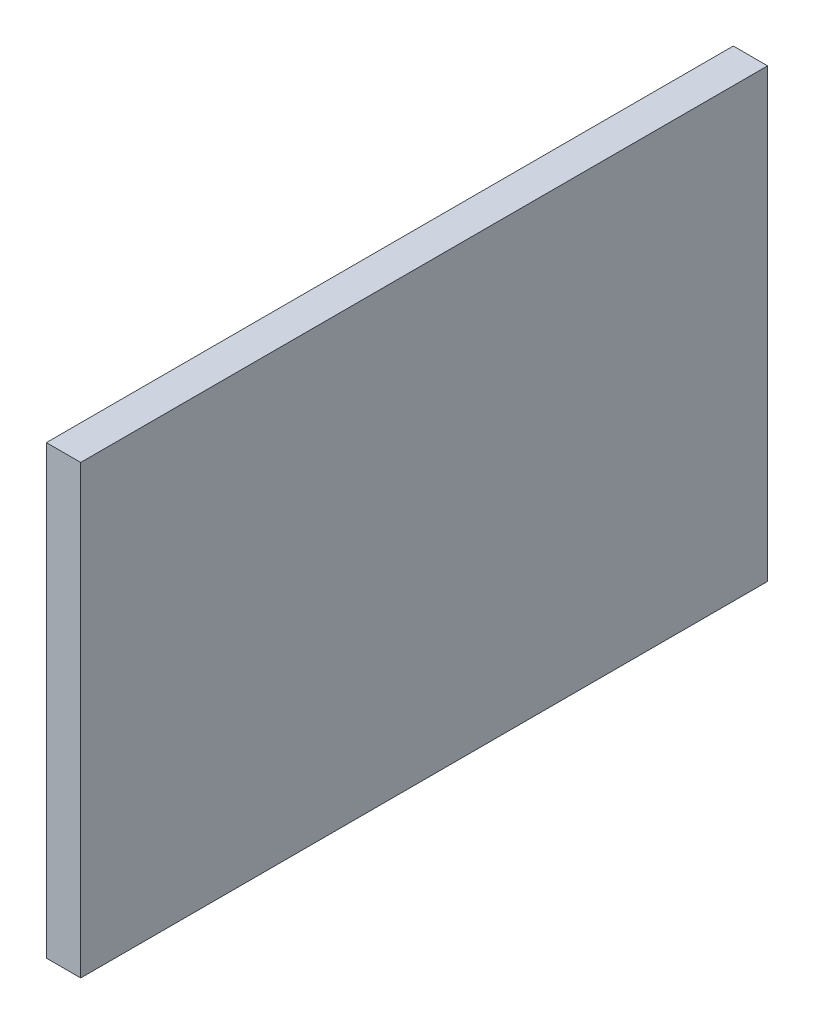
ISO-10303-21;
HEADER;
FILE_DESCRIPTION(('STEP AP214'),'2;1');
FILE_NAME('part.step','',(''),(''),'','','');
FILE_SCHEMA(('AUTOMOTIVE_DESIGN { 1 0 10303 214 1 1 1 1 }'));
ENDSEC;
DATA;
#1=APPLICATION_CONTEXT('core data for automotive mechanical design processes');
#2=APPLICATION_PROTOCOL_DEFINITION('international standard','automotive_design',2000,#1);
#3=PRODUCT_CONTEXT('',#1,'mechanical');
#4=PRODUCT('Part','Part','',(#3));
#5=PRODUCT_RELATED_PRODUCT_CATEGORY('part','',(#4));
#6=PRODUCT_DEFINITION_FORMATION('','',#4);
#7=PRODUCT_DEFINITION_CONTEXT('part definition',#1,'design');
#8=PRODUCT_DEFINITION('design','',#6,#7);
#9=PRODUCT_DEFINITION_SHAPE('','',#8);
#10=(LENGTH_UNIT() NAMED_UNIT(*) SI_UNIT(.MILLI.,.METRE.));
#11=(NAMED_UNIT(*) PLANE_ANGLE_UNIT() SI_UNIT($,.RADIAN.));
#12=(NAMED_UNIT(*) SI_UNIT($,.STERADIAN.) SOLID_ANGLE_UNIT());
#13=UNCERTAINTY_MEASURE_WITH_UNIT(LENGTH_MEASURE(1.E-05),#10,'distance_accuracy_value','');
#14=(GEOMETRIC_REPRESENTATION_CONTEXT(3) GLOBAL_UNCERTAINTY_ASSIGNED_CONTEXT((#13)) GLOBAL_UNIT_ASSIGNED_CONTEXT((#10,
#11,#12)) REPRESENTATION_CONTEXT('',''));
#15=CARTESIAN_POINT('',(0.,0.,0.));
#16=DIRECTION('',(0.,0.,1.));
#17=DIRECTION('',(1.,0.,0.));
#18=AXIS2_PLACEMENT_3D('',#15,#16,#17);
#19=CARTESIAN_POINT('',(25.4,26.8007352941176,466.818382352941));
#20=DIRECTION('',(0.,0.,-1.));
#21=DIRECTION('',(0.,1.,0.));
#22=AXIS2_PLACEMENT_3D('',#19,#20,#21);
#23=PLANE('',#22);
#24=DIRECTION('',(0.,-1.,0.));
#25=VECTOR('',#24,1.);
#26=CARTESIAN_POINT('',(0.,26.8007352941176,466.818382352941));
#27=LINE('',#26,#25);
#28=CARTESIAN_POINT('',(0.,26.8007352941176,466.818382352941));
#29=VERTEX_POINT('',#28);
#30=CARTESIAN_POINT('',(0.,-303.399264705882,466.818382352941));
#31=VERTEX_POINT('',#30);
#32=EDGE_CURVE('E97',#29,#31,#27,.T.);
#33=ORIENTED_EDGE('',*,*,#32,.T.);
#34=DIRECTION('',(-1.,0.,0.));
#35=VECTOR('',#34,1.);
#36=CARTESIAN_POINT('',(25.4,-303.399264705882,466.818382352941));
#37=LINE('',#36,#35);
#38=CARTESIAN_POINT('',(25.4,-303.399264705882,466.818382352941));
#39=VERTEX_POINT('',#38);
#40=EDGE_CURVE('E11',#39,#31,#37,.T.);
#41=ORIENTED_EDGE('',*,*,#40,.F.);
#42=DIRECTION('',(0.,-1.,0.));
#43=VECTOR('',#42,1.);
#44=CARTESIAN_POINT('',(25.4,26.8007352941176,466.818382352941));
#45=LINE('',#44,#43);
#46=CARTESIAN_POINT('',(25.4,26.8007352941176,466.818382352941));
#47=VERTEX_POINT('',#46);
#48=EDGE_CURVE('E85',#47,#39,#45,.T.);
#49=ORIENTED_EDGE('',*,*,#48,.F.);
#50=DIRECTION('',(-1.,0.,0.));
#51=VECTOR('',#50,1.);
#52=CARTESIAN_POINT('',(25.4,26.8007352941176,466.818382352941));
#53=LINE('',#52,#51);
#54=EDGE_CURVE('E93',#47,#29,#53,.T.);
#55=ORIENTED_EDGE('',*,*,#54,.T.);
#56=EDGE_LOOP('',(#33,#41,#49,#55));
#57=FACE_BOUND('',#56,.T.);
#58=ADVANCED_FACE('F34',(#57),#23,.F.);
#59=CARTESIAN_POINT('',(25.4,-303.399264705882,466.818382352941));
#60=DIRECTION('',(0.,1.,0.));
#61=DIRECTION('',(0.,0.,1.));
#62=AXIS2_PLACEMENT_3D('',#59,#60,#61);
#63=PLANE('',#62);
#64=DIRECTION('',(0.,0.,-1.));
#65=VECTOR('',#64,1.);
#66=CARTESIAN_POINT('',(0.,-303.399264705882,466.818382352941));
#67=LINE('',#66,#65);
#68=CARTESIAN_POINT('',(0.,-303.399264705882,-41.1816176470589));
#69=VERTEX_POINT('',#68);
#70=EDGE_CURVE('E89',#31,#69,#67,.T.);
#71=ORIENTED_EDGE('',*,*,#70,.T.);
#72=DIRECTION('',(-1.,0.,0.));
#73=VECTOR('',#72,1.);
#74=CARTESIAN_POINT('',(25.4,-303.399264705882,-41.1816176470589));
#75=LINE('',#74,#73);
#76=CARTESIAN_POINT('',(25.4,-303.399264705882,-41.1816176470589));
#77=VERTEX_POINT('',#76);
#78=EDGE_CURVE('E42',#77,#69,#75,.T.);
#79=ORIENTED_EDGE('',*,*,#78,.F.);
#80=DIRECTION('',(0.,0.,-1.));
#81=VECTOR('',#80,1.);
#82=CARTESIAN_POINT('',(25.4,-303.399264705882,466.818382352941));
#83=LINE('',#82,#81);
#84=EDGE_CURVE('E80',#39,#77,#83,.T.);
#85=ORIENTED_EDGE('',*,*,#84,.F.);
#86=ORIENTED_EDGE('',*,*,#40,.T.);
#87=EDGE_LOOP('',(#71,#79,#85,#86));
#88=FACE_BOUND('',#87,.T.);
#89=ADVANCED_FACE('F88',(#88),#63,.F.);
#90=CARTESIAN_POINT('',(25.4,26.8007352941176,-41.1816176470588));
#91=DIRECTION('',(0.,0.,1.));
#92=DIRECTION('',(0.,-1.,0.));
#93=AXIS2_PLACEMENT_3D('',#90,#91,#92);
#94=PLANE('',#93);
#95=DIRECTION('',(0.,1.,0.));
#96=VECTOR('',#95,1.);
#97=CARTESIAN_POINT('',(0.,26.8007352941176,-41.1816176470588));
#98=LINE('',#97,#96);
#99=CARTESIAN_POINT('',(0.,26.8007352941176,-41.1816176470588));
#100=VERTEX_POINT('',#99);
#101=EDGE_CURVE('E67',#69,#100,#98,.T.);
#102=ORIENTED_EDGE('',*,*,#101,.T.);
#103=DIRECTION('',(-1.,0.,0.));
#104=VECTOR('',#103,1.);
#105=CARTESIAN_POINT('',(25.4,26.8007352941176,-41.1816176470588));
#106=LINE('',#105,#104);
#107=CARTESIAN_POINT('',(25.4,26.8007352941176,-41.1816176470588));
#108=VERTEX_POINT('',#107);
#109=EDGE_CURVE('E90',#108,#100,#106,.T.);
#110=ORIENTED_EDGE('',*,*,#109,.F.);
#111=DIRECTION('',(0.,1.,0.));
#112=VECTOR('',#111,1.);
#113=CARTESIAN_POINT('',(25.4,26.8007352941176,-41.1816176470588));
#114=LINE('',#113,#112);
#115=EDGE_CURVE('E83',#77,#108,#114,.T.);
#116=ORIENTED_EDGE('',*,*,#115,.F.);
#117=ORIENTED_EDGE('',*,*,#78,.T.);
#118=EDGE_LOOP('',(#102,#110,#116,#117));
#119=FACE_BOUND('',#118,.T.);
#120=ADVANCED_FACE('F91',(#119),#94,.F.);
#121=CARTESIAN_POINT('',(25.4,26.8007352941176,466.818382352941));
#122=DIRECTION('',(0.,-1.,0.));
#123=DIRECTION('',(0.,0.,-1.));
#124=AXIS2_PLACEMENT_3D('',#121,#122,#123);
#125=PLANE('',#124);
#126=DIRECTION('',(0.,0.,1.));
#127=VECTOR('',#126,1.);
#128=CARTESIAN_POINT('',(0.,26.8007352941176,466.818382352941));
#129=LINE('',#128,#127);
#130=EDGE_CURVE('E73',#100,#29,#129,.T.);
#131=ORIENTED_EDGE('',*,*,#130,.T.);
#132=ORIENTED_EDGE('',*,*,#54,.F.);
#133=DIRECTION('',(0.,0.,1.));
#134=VECTOR('',#133,1.);
#135=CARTESIAN_POINT('',(25.4,26.8007352941176,466.818382352941));
#136=LINE('',#135,#134);
#137=EDGE_CURVE('E50',#108,#47,#136,.T.);
#138=ORIENTED_EDGE('',*,*,#137,.F.);
#139=ORIENTED_EDGE('',*,*,#109,.T.);
#140=EDGE_LOOP('',(#131,#132,#138,#139));
#141=FACE_BOUND('',#140,.T.);
#142=ADVANCED_FACE('F105',(#141),#125,.F.);
#143=CARTESIAN_POINT('',(25.4,0.,0.));
#144=DIRECTION('',(1.,0.,0.));
#145=DIRECTION('',(0.,0.,-1.));
#146=AXIS2_PLACEMENT_3D('',#143,#144,#145);
#147=PLANE('',#146);
#148=ORIENTED_EDGE('',*,*,#48,.T.);
#149=ORIENTED_EDGE('',*,*,#84,.T.);
#150=ORIENTED_EDGE('',*,*,#115,.T.);
#151=ORIENTED_EDGE('',*,*,#137,.T.);
#152=EDGE_LOOP('',(#148,#149,#150,#151));
#153=FACE_BOUND('',#152,.T.);
#154=ADVANCED_FACE('F81',(#153),#147,.T.);
#155=CARTESIAN_POINT('',(0.,0.,0.));
#156=DIRECTION('',(1.,0.,0.));
#157=DIRECTION('',(0.,0.,-1.));
#158=AXIS2_PLACEMENT_3D('',#155,#156,#157);
#159=PLANE('',#158);
#160=CARTESIAN_POINT('',(0.,-23.9992647058824,9.61838235294114));
#161=DIRECTION('',(-1.,0.,0.));
#162=DIRECTION('',(0.,0.,1.));
#163=AXIS2_PLACEMENT_3D('',#160,#161,#162);
#164=CIRCLE('',#163,12.7);
#165=CARTESIAN_POINT('',(0.,-23.9992647058824,22.3183823529411));
#166=VERTEX_POINT('',#165);
#167=EDGE_CURVE('E111',#166,#166,#164,.T.);
#168=ORIENTED_EDGE('',*,*,#167,.F.);
#169=EDGE_LOOP('',(#168));
#170=FACE_BOUND('',#169,.T.);
#171=ORIENTED_EDGE('',*,*,#32,.F.);
#172=ORIENTED_EDGE('',*,*,#130,.F.);
#173=ORIENTED_EDGE('',*,*,#101,.F.);
#174=ORIENTED_EDGE('',*,*,#70,.F.);
#175=EDGE_LOOP('',(#171,#172,#173,#174));
#176=FACE_BOUND('',#175,.T.);
#177=ADVANCED_FACE('F108',(#170,#176),#159,.F.);
#178=CARTESIAN_POINT('',(6.35,-23.9992647058824,9.61838235294114));
#179=DIRECTION('',(-1.,0.,0.));
#180=DIRECTION('',(0.,0.,1.));
#181=AXIS2_PLACEMENT_3D('',#178,#179,#180);
#182=CYLINDRICAL_SURFACE('',#181,12.7);
#183=CARTESIAN_POINT('',(6.35,-23.9992647058824,9.61838235294114));
#184=DIRECTION('',(-1.,0.,0.));
#185=DIRECTION('',(0.,0.,1.));
#186=AXIS2_PLACEMENT_3D('',#183,#184,#185);
#187=CIRCLE('',#186,12.7);
#188=CARTESIAN_POINT('',(6.35,-23.9992647058824,22.3183823529411));
#189=VERTEX_POINT('',#188);
#190=EDGE_CURVE('E100',#189,#189,#187,.T.);
#191=ORIENTED_EDGE('',*,*,#190,.F.);
#192=EDGE_LOOP('',(#191));
#193=FACE_BOUND('',#192,.T.);
#194=ORIENTED_EDGE('',*,*,#167,.T.);
#195=EDGE_LOOP('',(#194));
#196=FACE_BOUND('',#195,.T.);
#197=ADVANCED_FACE('F119',(#193,#196),#182,.F.);
#198=CARTESIAN_POINT('',(6.35,-23.9992647058824,9.61838235294114));
#199=DIRECTION('',(-1.,0.,0.));
#200=DIRECTION('',(0.,0.,1.));
#201=AXIS2_PLACEMENT_3D('',#198,#199,#200);
#202=PLANE('',#201);
#203=ORIENTED_EDGE('',*,*,#190,.T.);
#204=EDGE_LOOP('',(#203));
#205=FACE_BOUND('',#204,.T.);
#206=ADVANCED_FACE('F117',(#205),#202,.T.);
#207=CLOSED_SHELL('',(#58,#89,#120,#142,#154,#177,#197,#206));
#208=MANIFOLD_SOLID_BREP('B2',#207);
#209=ADVANCED_BREP_SHAPE_REPRESENTATION('',(#18,#208),#14);
#210=SHAPE_DEFINITION_REPRESENTATION(#9,#209);
ENDSEC;
END-ISO-10303-21;
